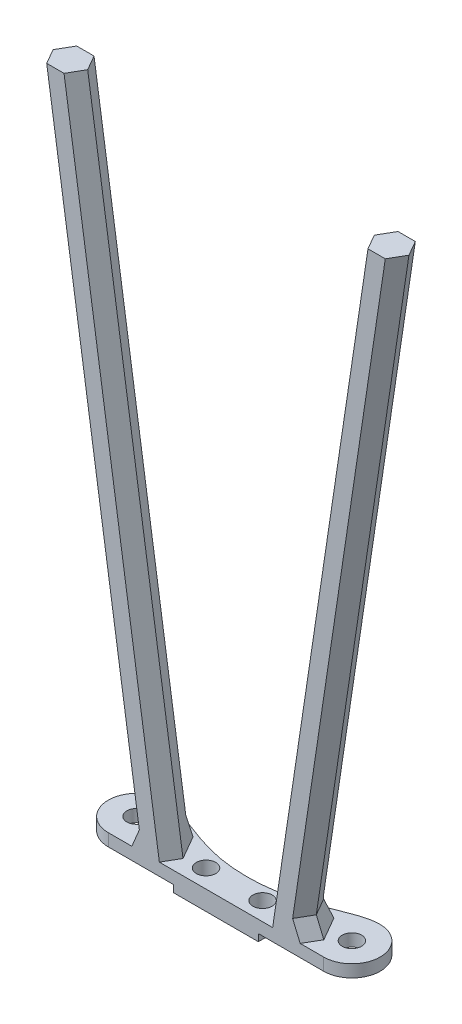
ISO-10303-21;
HEADER;
FILE_DESCRIPTION(('STEP AP214'),'2;1');
FILE_NAME('part.step','',(''),(''),'','','');
FILE_SCHEMA(('AUTOMOTIVE_DESIGN { 1 0 10303 214 1 1 1 1 }'));
ENDSEC;
DATA;
#1=APPLICATION_CONTEXT('core data for automotive mechanical design processes');
#2=APPLICATION_PROTOCOL_DEFINITION('international standard','automotive_design',2000,#1);
#3=PRODUCT_CONTEXT('',#1,'mechanical');
#4=PRODUCT('Part','Part','',(#3));
#5=PRODUCT_RELATED_PRODUCT_CATEGORY('part','',(#4));
#6=PRODUCT_DEFINITION_FORMATION('','',#4);
#7=PRODUCT_DEFINITION_CONTEXT('part definition',#1,'design');
#8=PRODUCT_DEFINITION('design','',#6,#7);
#9=PRODUCT_DEFINITION_SHAPE('','',#8);
#10=(LENGTH_UNIT() NAMED_UNIT(*) SI_UNIT(.MILLI.,.METRE.));
#11=(NAMED_UNIT(*) PLANE_ANGLE_UNIT() SI_UNIT($,.RADIAN.));
#12=(NAMED_UNIT(*) SI_UNIT($,.STERADIAN.) SOLID_ANGLE_UNIT());
#13=UNCERTAINTY_MEASURE_WITH_UNIT(LENGTH_MEASURE(1.E-05),#10,'distance_accuracy_value','');
#14=(GEOMETRIC_REPRESENTATION_CONTEXT(3) GLOBAL_UNCERTAINTY_ASSIGNED_CONTEXT((#13)) GLOBAL_UNIT_ASSIGNED_CONTEXT((#10,
#11,#12)) REPRESENTATION_CONTEXT('',''));
#15=CARTESIAN_POINT('',(0.,0.,0.));
#16=DIRECTION('',(0.,0.,1.));
#17=DIRECTION('',(1.,0.,0.));
#18=AXIS2_PLACEMENT_3D('',#15,#16,#17);
#19=CARTESIAN_POINT('',(0.,0.,0.));
#20=DIRECTION('',(0.,1.,0.));
#21=DIRECTION('',(0.,0.,1.));
#22=AXIS2_PLACEMENT_3D('',#19,#20,#21);
#23=PLANE('',#22);
#24=CARTESIAN_POINT('',(30.5,0.,0.));
#25=DIRECTION('',(0.,1.,0.));
#26=DIRECTION('',(0.,0.,1.));
#27=AXIS2_PLACEMENT_3D('',#24,#25,#26);
#28=CIRCLE('',#27,1.375);
#29=CARTESIAN_POINT('',(30.5,0.,1.375));
#30=VERTEX_POINT('',#29);
#31=EDGE_CURVE('E550',#30,#30,#28,.T.);
#32=ORIENTED_EDGE('',*,*,#31,.T.);
#33=EDGE_LOOP('',(#32));
#34=FACE_BOUND('',#33,.T.);
#35=DIRECTION('',(0.,0.,1.));
#36=VECTOR('',#35,1.);
#37=CARTESIAN_POINT('',(21.25,0.,4.));
#38=LINE('',#37,#36);
#39=CARTESIAN_POINT('',(21.2500000022777,0.,-1.18515930909375));
#40=VERTEX_POINT('',#39);
#41=CARTESIAN_POINT('',(21.2499999999999,0.,4.));
#42=VERTEX_POINT('',#41);
#43=EDGE_CURVE('E257',#40,#42,#38,.T.);
#44=ORIENTED_EDGE('',*,*,#43,.F.);
#45=CARTESIAN_POINT('',(0.,0.,-4.));
#46=CARTESIAN_POINT('',(1.39255410455017,0.,-4.));
#47=CARTESIAN_POINT('',(4.71281611874439,0.,-2.73030225078324));
#48=CARTESIAN_POINT('',(11.2000863087399,0.,-0.21231389307512));
#49=CARTESIAN_POINT('',(19.2746966248633,0.,-0.21231389307512));
#50=CARTESIAN_POINT('',(25.8425779606495,0.,-2.73030225078324));
#51=CARTESIAN_POINT('',(29.0287654370058,0.,-4.));
#52=CARTESIAN_POINT('',(30.5,0.,-4.));
#53=B_SPLINE_CURVE_WITH_KNOTS('',3,(#45,#46,#47,#48,#49,#50,#51,#52),.UNSPECIFIED.,.F.,.F.,(4,1,
1,1,1,4),(0.,0.131328662270549,0.332777634257892,0.667222365742108,0.868671337729451,1.),.UNSPECIFIED.);
#54=CARTESIAN_POINT('',(30.5,0.,-4.));
#55=VERTEX_POINT('',#54);
#56=EDGE_CURVE('E530',#40,#55,#53,.T.);
#57=ORIENTED_EDGE('',*,*,#56,.T.);
#58=CARTESIAN_POINT('',(30.5,0.,0.));
#59=DIRECTION('',(0.,1.,0.));
#60=DIRECTION('',(0.,0.,1.));
#61=AXIS2_PLACEMENT_3D('',#58,#59,#60);
#62=CIRCLE('',#61,4.);
#63=CARTESIAN_POINT('',(30.5,0.,4.));
#64=VERTEX_POINT('',#63);
#65=EDGE_CURVE('E496',#64,#55,#62,.T.);
#66=ORIENTED_EDGE('',*,*,#65,.F.);
#67=DIRECTION('',(1.,0.,0.));
#68=VECTOR('',#67,1.);
#69=CARTESIAN_POINT('',(0.,0.,4.));
#70=LINE('',#69,#68);
#71=EDGE_CURVE('E87',#42,#64,#70,.T.);
#72=ORIENTED_EDGE('',*,*,#71,.F.);
#73=EDGE_LOOP('',(#44,#57,#66,#72));
#74=FACE_BOUND('',#73,.T.);
#75=ADVANCED_FACE('F67',(#34,#74),#23,.F.);
#76=CARTESIAN_POINT('',(0.,0.,0.));
#77=DIRECTION('',(0.,1.,0.));
#78=DIRECTION('',(0.,0.,1.));
#79=AXIS2_PLACEMENT_3D('',#76,#77,#78);
#80=CIRCLE('',#79,1.375);
#81=CARTESIAN_POINT('',(0.,0.,1.375));
#82=VERTEX_POINT('',#81);
#83=EDGE_CURVE('E567',#82,#82,#80,.T.);
#84=ORIENTED_EDGE('',*,*,#83,.T.);
#85=EDGE_LOOP('',(#84));
#86=FACE_BOUND('',#85,.T.);
#87=DIRECTION('',(0.,0.,-1.));
#88=VECTOR('',#87,1.);
#89=CARTESIAN_POINT('',(9.25,0.,4.));
#90=LINE('',#89,#88);
#91=CARTESIAN_POINT('',(9.25000000000021,0.,4.));
#92=VERTEX_POINT('',#91);
#93=CARTESIAN_POINT('',(9.25000000000044,0.,-1.18670499105833));
#94=VERTEX_POINT('',#93);
#95=EDGE_CURVE('E95',#92,#94,#90,.T.);
#96=ORIENTED_EDGE('',*,*,#95,.F.);
#97=CARTESIAN_POINT('',(0.,0.,4.));
#98=VERTEX_POINT('',#97);
#99=EDGE_CURVE('E261',#98,#92,#70,.T.);
#100=ORIENTED_EDGE('',*,*,#99,.F.);
#101=CARTESIAN_POINT('',(0.,0.,0.));
#102=DIRECTION('',(0.,1.,0.));
#103=DIRECTION('',(0.,0.,1.));
#104=AXIS2_PLACEMENT_3D('',#101,#102,#103);
#105=CIRCLE('',#104,4.);
#106=CARTESIAN_POINT('',(0.,0.,-4.));
#107=VERTEX_POINT('',#106);
#108=EDGE_CURVE('E507',#107,#98,#105,.T.);
#109=ORIENTED_EDGE('',*,*,#108,.F.);
#110=EDGE_CURVE('E533',#107,#94,#53,.T.);
#111=ORIENTED_EDGE('',*,*,#110,.T.);
#112=EDGE_LOOP('',(#96,#100,#109,#111));
#113=FACE_BOUND('',#112,.T.);
#114=ADVANCED_FACE('F549',(#86,#113),#23,.F.);
#115=CARTESIAN_POINT('',(0.,1.75,0.));
#116=DIRECTION('',(0.,1.,0.));
#117=DIRECTION('',(0.,0.,1.));
#118=AXIS2_PLACEMENT_3D('',#115,#116,#117);
#119=PLANE('',#118);
#120=CARTESIAN_POINT('',(11.2499999958524,1.75,1.40677631135101));
#121=DIRECTION('',(0.,1.,0.));
#122=DIRECTION('',(0.,0.,1.));
#123=AXIS2_PLACEMENT_3D('',#120,#121,#122);
#124=CIRCLE('',#123,1.375);
#125=CARTESIAN_POINT('',(11.2499999958524,1.75,2.78177631135101));
#126=VERTEX_POINT('',#125);
#127=EDGE_CURVE('E552',#126,#126,#124,.T.);
#128=ORIENTED_EDGE('',*,*,#127,.F.);
#129=EDGE_LOOP('',(#128));
#130=FACE_BOUND('',#129,.T.);
#131=CARTESIAN_POINT('',(19.2500000041475,1.75,1.4072915388733));
#132=DIRECTION('',(0.,1.,0.));
#133=DIRECTION('',(0.,0.,1.));
#134=AXIS2_PLACEMENT_3D('',#131,#132,#133);
#135=CIRCLE('',#134,1.375);
#136=CARTESIAN_POINT('',(19.2500000041475,1.75,2.7822915388733));
#137=VERTEX_POINT('',#136);
#138=EDGE_CURVE('E604',#137,#137,#135,.T.);
#139=ORIENTED_EDGE('',*,*,#138,.F.);
#140=EDGE_LOOP('',(#139));
#141=FACE_BOUND('',#140,.T.);
#142=CARTESIAN_POINT('',(0.,1.75,0.));
#143=DIRECTION('',(0.,1.,0.));
#144=DIRECTION('',(0.,0.,1.));
#145=AXIS2_PLACEMENT_3D('',#142,#143,#144);
#146=CIRCLE('',#145,1.375);
#147=CARTESIAN_POINT('',(0.,1.75,1.375));
#148=VERTEX_POINT('',#147);
#149=EDGE_CURVE('E509',#148,#148,#146,.T.);
#150=ORIENTED_EDGE('',*,*,#149,.F.);
#151=EDGE_LOOP('',(#150));
#152=FACE_BOUND('',#151,.T.);
#153=CARTESIAN_POINT('',(30.5,1.75,0.));
#154=DIRECTION('',(0.,1.,0.));
#155=DIRECTION('',(0.,0.,1.));
#156=AXIS2_PLACEMENT_3D('',#153,#154,#155);
#157=CIRCLE('',#156,1.375);
#158=CARTESIAN_POINT('',(30.5,1.75,1.375));
#159=VERTEX_POINT('',#158);
#160=EDGE_CURVE('E560',#159,#159,#157,.T.);
#161=ORIENTED_EDGE('',*,*,#160,.F.);
#162=EDGE_LOOP('',(#161));
#163=FACE_BOUND('',#162,.T.);
#164=DIRECTION('',(0.5,0.,-0.866025403784438));
#165=VECTOR('',#164,1.);
#166=CARTESIAN_POINT('',(22.0462613559441,1.75,1.87500000000001));
#167=LINE('',#166,#165);
#168=CARTESIAN_POINT('',(22.0462613559441,1.75,1.875));
#169=VERTEX_POINT('',#168);
#170=CARTESIAN_POINT('',(23.9948185144591,1.75,-1.5));
#171=VERTEX_POINT('',#170);
#172=EDGE_CURVE('E410',#169,#171,#167,.T.);
#173=ORIENTED_EDGE('',*,*,#172,.T.);
#174=DIRECTION('',(1.,0.,0.));
#175=VECTOR('',#174,1.);
#176=CARTESIAN_POINT('',(0.,1.75,-1.5));
#177=LINE('',#176,#175);
#178=CARTESIAN_POINT('',(26.448557158515,1.75,-1.5));
#179=VERTEX_POINT('',#178);
#180=EDGE_CURVE('E1011',#171,#179,#177,.T.);
#181=ORIENTED_EDGE('',*,*,#180,.T.);
#182=DIRECTION('',(0.5,0.,0.866025403784439));
#183=VECTOR('',#182,1.);
#184=CARTESIAN_POINT('',(20.4859369217246,1.75,-11.8275611963594));
#185=LINE('',#184,#183);
#186=CARTESIAN_POINT('',(28.39711431703,1.75,1.875));
#187=VERTEX_POINT('',#186);
#188=EDGE_CURVE('E1013',#179,#187,#185,.T.);
#189=ORIENTED_EDGE('',*,*,#188,.T.);
#190=DIRECTION('',(-0.5,0.,0.866025403784439));
#191=VECTOR('',#190,1.);
#192=CARTESIAN_POINT('',(22.1097345538204,1.75,12.7650611963594));
#193=LINE('',#192,#191);
#194=CARTESIAN_POINT('',(27.170244995002,1.75,4.));
#195=VERTEX_POINT('',#194);
#196=EDGE_CURVE('E402',#187,#195,#193,.T.);
#197=ORIENTED_EDGE('',*,*,#196,.T.);
#198=DIRECTION('',(1.,0.,0.));
#199=VECTOR('',#198,1.);
#200=CARTESIAN_POINT('',(0.,1.75,4.));
#201=LINE('',#200,#199);
#202=CARTESIAN_POINT('',(30.5,1.75,4.));
#203=VERTEX_POINT('',#202);
#204=EDGE_CURVE('E423',#195,#203,#201,.T.);
#205=ORIENTED_EDGE('',*,*,#204,.T.);
#206=CARTESIAN_POINT('',(30.5,1.75,0.));
#207=DIRECTION('',(0.,1.,0.));
#208=DIRECTION('',(0.,0.,1.));
#209=AXIS2_PLACEMENT_3D('',#206,#207,#208);
#210=CIRCLE('',#209,4.);
#211=CARTESIAN_POINT('',(30.5,1.75,-4.));
#212=VERTEX_POINT('',#211);
#213=EDGE_CURVE('E504',#203,#212,#210,.T.);
#214=ORIENTED_EDGE('',*,*,#213,.T.);
#215=CARTESIAN_POINT('',(0.,1.75,-4.));
#216=CARTESIAN_POINT('',(1.39255410455017,1.75,-4.));
#217=CARTESIAN_POINT('',(4.71281611874439,1.75,-2.73030225078324));
#218=CARTESIAN_POINT('',(11.2000863087399,1.75,-0.21231389307512));
#219=CARTESIAN_POINT('',(19.2746966248633,1.75,-0.21231389307512));
#220=CARTESIAN_POINT('',(25.8425779606495,1.75,-2.73030225078324));
#221=CARTESIAN_POINT('',(29.0287654370058,1.75,-4.));
#222=CARTESIAN_POINT('',(30.5,1.75,-4.));
#223=B_SPLINE_CURVE_WITH_KNOTS('',3,(#215,#216,#217,#218,#219,#220,#221,#222),.UNSPECIFIED.,.F.,
.F.,(4,1,1,1,1,4),(0.,0.131328662270549,0.332777634257892,0.667222365742108,0.868671337729451,
1.),.UNSPECIFIED.);
#224=CARTESIAN_POINT('',(0.,1.75,-4.));
#225=VERTEX_POINT('',#224);
#226=EDGE_CURVE('E534',#225,#212,#223,.T.);
#227=ORIENTED_EDGE('',*,*,#226,.F.);
#228=CARTESIAN_POINT('',(0.,1.75,0.));
#229=DIRECTION('',(0.,1.,0.));
#230=DIRECTION('',(0.,0.,1.));
#231=AXIS2_PLACEMENT_3D('',#228,#229,#230);
#232=CIRCLE('',#231,4.);
#233=CARTESIAN_POINT('',(0.,1.75,4.));
#234=VERTEX_POINT('',#233);
#235=EDGE_CURVE('E499',#225,#234,#232,.T.);
#236=ORIENTED_EDGE('',*,*,#235,.T.);
#237=CARTESIAN_POINT('',(3.32975500499798,1.75,4.));
#238=VERTEX_POINT('',#237);
#239=EDGE_CURVE('E512',#234,#238,#201,.T.);
#240=ORIENTED_EDGE('',*,*,#239,.T.);
#241=DIRECTION('',(-0.5,0.,-0.866025403784439));
#242=VECTOR('',#241,1.);
#243=CARTESIAN_POINT('',(0.765265446179611,1.75,-0.441826211353318));
#244=LINE('',#243,#242);
#245=CARTESIAN_POINT('',(2.10288568297003,1.75,1.875));
#246=VERTEX_POINT('',#245);
#247=EDGE_CURVE('E474',#238,#246,#244,.T.);
#248=ORIENTED_EDGE('',*,*,#247,.T.);
#249=DIRECTION('',(0.5,0.,-0.866025403784439));
#250=VECTOR('',#249,1.);
#251=CARTESIAN_POINT('',(2.38906307827543,1.75,1.37932621135332));
#252=LINE('',#251,#250);
#253=CARTESIAN_POINT('',(4.05144284148502,1.75,-1.5));
#254=VERTEX_POINT('',#253);
#255=EDGE_CURVE('E472',#246,#254,#252,.T.);
#256=ORIENTED_EDGE('',*,*,#255,.T.);
#257=DIRECTION('',(1.,0.,0.));
#258=VECTOR('',#257,1.);
#259=CARTESIAN_POINT('',(0.,1.75,-1.5));
#260=LINE('',#259,#258);
#261=CARTESIAN_POINT('',(6.50518148554092,1.75,-1.5));
#262=VERTEX_POINT('',#261);
#263=EDGE_CURVE('E469',#254,#262,#260,.T.);
#264=ORIENTED_EDGE('',*,*,#263,.T.);
#265=DIRECTION('',(-0.5,0.,-0.866025403784438));
#266=VECTOR('',#265,1.);
#267=CARTESIAN_POINT('',(8.45373864405591,1.75,1.875));
#268=LINE('',#267,#266);
#269=CARTESIAN_POINT('',(8.45373864405591,1.75,1.875));
#270=VERTEX_POINT('',#269);
#271=EDGE_CURVE('E986',#270,#262,#268,.T.);
#272=ORIENTED_EDGE('',*,*,#271,.F.);
#273=DIRECTION('',(0.500000000000001,0.,-0.866025403784438));
#274=VECTOR('',#273,1.);
#275=CARTESIAN_POINT('',(7.22686932202795,1.75,4.));
#276=LINE('',#275,#274);
#277=CARTESIAN_POINT('',(7.22686932202795,1.75,4.));
#278=VERTEX_POINT('',#277);
#279=EDGE_CURVE('E409',#278,#270,#276,.T.);
#280=ORIENTED_EDGE('',*,*,#279,.F.);
#281=CARTESIAN_POINT('',(23.273130677972,1.75,4.));
#282=VERTEX_POINT('',#281);
#283=EDGE_CURVE('E515',#278,#282,#201,.T.);
#284=ORIENTED_EDGE('',*,*,#283,.T.);
#285=DIRECTION('',(-0.5,0.,-0.866025403784439));
#286=VECTOR('',#285,1.);
#287=CARTESIAN_POINT('',(23.273130677972,1.75,4.));
#288=LINE('',#287,#286);
#289=EDGE_CURVE('E413',#282,#169,#288,.T.);
#290=ORIENTED_EDGE('',*,*,#289,.T.);
#291=EDGE_LOOP('',(#173,#181,#189,#197,#205,#214,#227,#236,#240,#248,#256,#264,#272,#280,#284,#290));
#292=FACE_BOUND('',#291,.T.);
#293=ADVANCED_FACE('F543',(#130,#141,#152,#163,#292),#119,.T.);
#294=CARTESIAN_POINT('',(0.,1.75,0.));
#295=DIRECTION('',(0.,-1.,0.));
#296=DIRECTION('',(0.,0.,-1.));
#297=AXIS2_PLACEMENT_3D('',#294,#295,#296);
#298=CYLINDRICAL_SURFACE('',#297,4.);
#299=ORIENTED_EDGE('',*,*,#108,.T.);
#300=DIRECTION('',(0.,-1.,0.));
#301=VECTOR('',#300,1.);
#302=CARTESIAN_POINT('',(0.,1.75,4.));
#303=LINE('',#302,#301);
#304=EDGE_CURVE('E477',#234,#98,#303,.T.);
#305=ORIENTED_EDGE('',*,*,#304,.F.);
#306=ORIENTED_EDGE('',*,*,#235,.F.);
#307=DIRECTION('',(0.,-1.,0.));
#308=VECTOR('',#307,1.);
#309=CARTESIAN_POINT('',(0.,1.75,-4.));
#310=LINE('',#309,#308);
#311=EDGE_CURVE('E493',#225,#107,#310,.T.);
#312=ORIENTED_EDGE('',*,*,#311,.T.);
#313=EDGE_LOOP('',(#299,#305,#306,#312));
#314=FACE_BOUND('',#313,.T.);
#315=ADVANCED_FACE('F436',(#314),#298,.T.);
#316=CARTESIAN_POINT('',(0.,1.75,4.));
#317=DIRECTION('',(0.,0.,-1.));
#318=DIRECTION('',(-1.,0.,0.));
#319=AXIS2_PLACEMENT_3D('',#316,#317,#318);
#320=PLANE('',#319);
#321=ORIENTED_EDGE('',*,*,#99,.T.);
#322=DIRECTION('',(0.,1.,0.));
#323=VECTOR('',#322,1.);
#324=CARTESIAN_POINT('',(9.25,-1.,4.));
#325=LINE('',#324,#323);
#326=CARTESIAN_POINT('',(9.25,-1.,4.));
#327=VERTEX_POINT('',#326);
#328=EDGE_CURVE('E242',#327,#92,#325,.T.);
#329=ORIENTED_EDGE('',*,*,#328,.F.);
#330=DIRECTION('',(-1.,0.,0.));
#331=VECTOR('',#330,1.);
#332=CARTESIAN_POINT('',(9.25,-1.,4.));
#333=LINE('',#332,#331);
#334=CARTESIAN_POINT('',(21.25,-1.,4.));
#335=VERTEX_POINT('',#334);
#336=EDGE_CURVE('E248',#335,#327,#333,.T.);
#337=ORIENTED_EDGE('',*,*,#336,.F.);
#338=DIRECTION('',(0.,1.,0.));
#339=VECTOR('',#338,1.);
#340=CARTESIAN_POINT('',(21.25,-1.,4.));
#341=LINE('',#340,#339);
#342=EDGE_CURVE('E270',#335,#42,#341,.T.);
#343=ORIENTED_EDGE('',*,*,#342,.T.);
#344=ORIENTED_EDGE('',*,*,#71,.T.);
#345=DIRECTION('',(0.,-1.,0.));
#346=VECTOR('',#345,1.);
#347=CARTESIAN_POINT('',(30.5,1.75,4.));
#348=LINE('',#347,#346);
#349=EDGE_CURVE('E482',#203,#64,#348,.T.);
#350=ORIENTED_EDGE('',*,*,#349,.F.);
#351=ORIENTED_EDGE('',*,*,#204,.F.);
#352=DIRECTION('',(-0.38744925241057,0.92189103304376,0.));
#353=VECTOR('',#352,1.);
#354=CARTESIAN_POINT('',(23.0915314139385,11.4548308993813,4.));
#355=LINE('',#354,#353);
#356=CARTESIAN_POINT('',(26.1065207776194,4.28100970394284,4.));
#357=VERTEX_POINT('',#356);
#358=EDGE_CURVE('E12',#195,#357,#355,.T.);
#359=ORIENTED_EDGE('',*,*,#358,.T.);
#360=DIRECTION('',(0.148340452930245,0.988936352868298,0.));
#361=VECTOR('',#360,1.);
#362=CARTESIAN_POINT('',(25.726869322028,1.75,4.));
#363=LINE('',#362,#361);
#364=CARTESIAN_POINT('',(39.226869322028,91.75,4.));
#365=VERTEX_POINT('',#364);
#366=EDGE_CURVE('E998',#357,#365,#363,.T.);
#367=ORIENTED_EDGE('',*,*,#366,.T.);
#368=CARTESIAN_POINT('',(39.226869322028,91.75,4.));
#369=DIRECTION('',(-1.,0.,0.));
#370=VECTOR('',#369,1.);
#371=LINE('',#368,#370);
#372=CARTESIAN_POINT('',(36.773130677972,91.75,4.));
#373=VERTEX_POINT('',#372);
#374=EDGE_CURVE('E323',#365,#373,#371,.T.);
#375=ORIENTED_EDGE('',*,*,#374,.T.);
#376=DIRECTION('',(0.148340452930245,0.988936352868298,0.));
#377=VECTOR('',#376,1.);
#378=CARTESIAN_POINT('',(23.273130677972,1.75,4.));
#379=LINE('',#378,#377);
#380=EDGE_CURVE('E412',#282,#373,#379,.T.);
#381=ORIENTED_EDGE('',*,*,#380,.F.);
#382=ORIENTED_EDGE('',*,*,#283,.F.);
#383=DIRECTION('',(-0.148340452930245,0.988936352868298,0.));
#384=VECTOR('',#383,1.);
#385=CARTESIAN_POINT('',(7.22686932202795,1.75,4.));
#386=LINE('',#385,#384);
#387=CARTESIAN_POINT('',(-6.27313067797204,91.75,4.));
#388=VERTEX_POINT('',#387);
#389=EDGE_CURVE('E384',#278,#388,#386,.T.);
#390=ORIENTED_EDGE('',*,*,#389,.T.);
#391=DIRECTION('',(1.,0.,0.));
#392=VECTOR('',#391,1.);
#393=CARTESIAN_POINT('',(-8.72686932202795,91.75,4.));
#394=LINE('',#393,#392);
#395=CARTESIAN_POINT('',(-8.72686932202795,91.75,4.));
#396=VERTEX_POINT('',#395);
#397=EDGE_CURVE('E541',#396,#388,#394,.T.);
#398=ORIENTED_EDGE('',*,*,#397,.F.);
#399=DIRECTION('',(-0.148340452930245,0.988936352868298,0.));
#400=VECTOR('',#399,1.);
#401=CARTESIAN_POINT('',(4.77313067797204,1.75,4.));
#402=LINE('',#401,#400);
#403=CARTESIAN_POINT('',(4.39347922238062,4.28100970394282,4.));
#404=VERTEX_POINT('',#403);
#405=EDGE_CURVE('E387',#404,#396,#402,.T.);
#406=ORIENTED_EDGE('',*,*,#405,.F.);
#407=DIRECTION('',(-0.38744925241057,-0.92189103304376,0.));
#408=VECTOR('',#407,1.);
#409=CARTESIAN_POINT('',(2.8299024286595,0.560658156898535,4.));
#410=LINE('',#409,#408);
#411=EDGE_CURVE('E400',#404,#238,#410,.T.);
#412=ORIENTED_EDGE('',*,*,#411,.T.);
#413=ORIENTED_EDGE('',*,*,#239,.F.);
#414=ORIENTED_EDGE('',*,*,#304,.T.);
#415=EDGE_LOOP('',(#321,#329,#337,#343,#344,#350,#351,#359,#367,#375,#381,#382,#390,#398,#406,
#412,#413,#414));
#416=FACE_BOUND('',#415,.T.);
#417=ADVANCED_FACE('F259',(#416),#320,.F.);
#418=CARTESIAN_POINT('',(30.5,1.75,0.));
#419=DIRECTION('',(0.,-1.,0.));
#420=DIRECTION('',(0.,0.,-1.));
#421=AXIS2_PLACEMENT_3D('',#418,#419,#420);
#422=CYLINDRICAL_SURFACE('',#421,4.);
#423=ORIENTED_EDGE('',*,*,#65,.T.);
#424=DIRECTION('',(0.,-1.,0.));
#425=VECTOR('',#424,1.);
#426=CARTESIAN_POINT('',(30.5,1.75,-4.));
#427=LINE('',#426,#425);
#428=EDGE_CURVE('E487',#212,#55,#427,.T.);
#429=ORIENTED_EDGE('',*,*,#428,.F.);
#430=ORIENTED_EDGE('',*,*,#213,.F.);
#431=ORIENTED_EDGE('',*,*,#349,.T.);
#432=EDGE_LOOP('',(#423,#429,#430,#431));
#433=FACE_BOUND('',#432,.T.);
#434=ADVANCED_FACE('F435',(#433),#422,.T.);
#435=CARTESIAN_POINT('',(0.,1.75,0.));
#436=DIRECTION('',(0.,-1.,0.));
#437=DIRECTION('',(0.,0.,-1.));
#438=AXIS2_PLACEMENT_3D('',#435,#436,#437);
#439=CYLINDRICAL_SURFACE('',#438,1.375);
#440=ORIENTED_EDGE('',*,*,#149,.T.);
#441=EDGE_LOOP('',(#440));
#442=FACE_BOUND('',#441,.T.);
#443=ORIENTED_EDGE('',*,*,#83,.F.);
#444=EDGE_LOOP('',(#443));
#445=FACE_BOUND('',#444,.T.);
#446=ADVANCED_FACE('F575',(#442,#445),#439,.F.);
#447=CARTESIAN_POINT('',(30.5,1.75,0.));
#448=DIRECTION('',(0.,-1.,0.));
#449=DIRECTION('',(0.,0.,-1.));
#450=AXIS2_PLACEMENT_3D('',#447,#448,#449);
#451=CYLINDRICAL_SURFACE('',#450,1.375);
#452=ORIENTED_EDGE('',*,*,#160,.T.);
#453=EDGE_LOOP('',(#452));
#454=FACE_BOUND('',#453,.T.);
#455=ORIENTED_EDGE('',*,*,#31,.F.);
#456=EDGE_LOOP('',(#455));
#457=FACE_BOUND('',#456,.T.);
#458=ADVANCED_FACE('F577',(#454,#457),#451,.F.);
#459=CARTESIAN_POINT('',(0.,-8.25,-4.));
#460=CARTESIAN_POINT('',(1.39255410455017,-8.25,-4.));
#461=CARTESIAN_POINT('',(4.71281611874439,-8.25,-2.73030225078324));
#462=CARTESIAN_POINT('',(11.2000863087399,-8.25,-0.21231389307512));
#463=CARTESIAN_POINT('',(19.2746966248633,-8.25,-0.21231389307512));
#464=CARTESIAN_POINT('',(25.8425779606495,-8.25,-2.73030225078324));
#465=CARTESIAN_POINT('',(29.0287654370058,-8.25,-4.));
#466=CARTESIAN_POINT('',(30.5,-8.25,-4.));
#467=B_SPLINE_CURVE_WITH_KNOTS('',3,(#459,#460,#461,#462,#463,#464,#465,#466),.UNSPECIFIED.,.F.,
.F.,(4,1,1,1,1,4),(0.,0.131328662270549,0.332777634257892,0.667222365742108,0.868671337729451,
1.),.UNSPECIFIED.);
#468=DIRECTION('',(0.,1.,0.));
#469=VECTOR('',#468,1.);
#470=SURFACE_OF_LINEAR_EXTRUSION('',#467,#469);
#471=ORIENTED_EDGE('',*,*,#311,.F.);
#472=ORIENTED_EDGE('',*,*,#226,.T.);
#473=ORIENTED_EDGE('',*,*,#428,.T.);
#474=ORIENTED_EDGE('',*,*,#56,.F.);
#475=DIRECTION('',(0.,1.,0.));
#476=VECTOR('',#475,1.);
#477=CARTESIAN_POINT('',(21.2499999999998,-0.5,-1.18515930849314));
#478=LINE('',#477,#476);
#479=CARTESIAN_POINT('',(21.2499999999995,-1.,-1.18515930849306));
#480=VERTEX_POINT('',#479);
#481=EDGE_CURVE('E266',#480,#40,#478,.T.);
#482=ORIENTED_EDGE('',*,*,#481,.F.);
#483=CARTESIAN_POINT('',(21.2499999999995,-1.,-1.18515930849306));
#484=CARTESIAN_POINT('',(21.0011776639861,-1.,-1.11955383888622));
#485=CARTESIAN_POINT('',(17.3367659021271,-1.,-0.21231389307512));
#486=CARTESIAN_POINT('',(13.1359122372325,-1.,-0.21231389307512));
#487=CARTESIAN_POINT('',(9.49875644908344,-1.,-1.12052572867879));
#488=CARTESIAN_POINT('',(9.25000000000059,-1.,-1.18670499105829));
#489=B_SPLINE_CURVE_WITH_KNOTS('',3,(#483,#484,#485,#486,#487,#488),.UNSPECIFIED.,.F.,.F.,(4,1,
1,4),(0.308100916714488,0.33258543246014,0.667030163944357,0.691706881487761),.UNSPECIFIED.);
#490=CARTESIAN_POINT('',(9.25000000000044,-1.,-1.18670499105833));
#491=VERTEX_POINT('',#490);
#492=EDGE_CURVE('E247',#491,#480,#489,.F.);
#493=ORIENTED_EDGE('',*,*,#492,.F.);
#494=DIRECTION('',(0.,1.,0.));
#495=VECTOR('',#494,1.);
#496=CARTESIAN_POINT('',(9.25000000000043,-0.5,-1.18670499105833));
#497=LINE('',#496,#495);
#498=EDGE_CURVE('E244',#491,#94,#497,.T.);
#499=ORIENTED_EDGE('',*,*,#498,.T.);
#500=ORIENTED_EDGE('',*,*,#110,.F.);
#501=EDGE_LOOP('',(#471,#472,#473,#474,#482,#493,#499,#500));
#502=FACE_BOUND('',#501,.T.);
#503=ADVANCED_FACE('F536',(#502),#470,.F.);
#504=CARTESIAN_POINT('',(0.,91.75,0.));
#505=DIRECTION('',(0.,1.,0.));
#506=DIRECTION('',(0.,0.,1.));
#507=AXIS2_PLACEMENT_3D('',#504,#505,#506);
#508=PLANE('',#507);
#509=DIRECTION('',(0.5,0.,-0.866025403784439));
#510=VECTOR('',#509,1.);
#511=CARTESIAN_POINT('',(-6.27313067797204,91.75,4.));
#512=LINE('',#511,#510);
#513=CARTESIAN_POINT('',(-5.04626135594409,91.75,1.875));
#514=VERTEX_POINT('',#513);
#515=EDGE_CURVE('E468',#388,#514,#512,.T.);
#516=ORIENTED_EDGE('',*,*,#515,.T.);
#517=DIRECTION('',(-0.5,0.,-0.866025403784439));
#518=VECTOR('',#517,1.);
#519=CARTESIAN_POINT('',(-5.04626135594409,91.75,1.875));
#520=LINE('',#519,#518);
#521=CARTESIAN_POINT('',(-6.27313067797204,91.75,-0.250000000000003));
#522=VERTEX_POINT('',#521);
#523=EDGE_CURVE('E911',#514,#522,#520,.T.);
#524=ORIENTED_EDGE('',*,*,#523,.T.);
#525=DIRECTION('',(-1.,0.,0.));
#526=VECTOR('',#525,1.);
#527=CARTESIAN_POINT('',(-6.27313067797204,91.75,-0.250000000000002));
#528=LINE('',#527,#526);
#529=CARTESIAN_POINT('',(-8.72686932202796,91.75,-0.250000000000002));
#530=VERTEX_POINT('',#529);
#531=EDGE_CURVE('E918',#522,#530,#528,.T.);
#532=ORIENTED_EDGE('',*,*,#531,.T.);
#533=DIRECTION('',(-0.5,0.,0.866025403784439));
#534=VECTOR('',#533,1.);
#535=CARTESIAN_POINT('',(-8.72686932202796,91.75,-0.250000000000002));
#536=LINE('',#535,#534);
#537=CARTESIAN_POINT('',(-9.95373864405591,91.75,1.875));
#538=VERTEX_POINT('',#537);
#539=EDGE_CURVE('E922',#530,#538,#536,.T.);
#540=ORIENTED_EDGE('',*,*,#539,.T.);
#541=DIRECTION('',(0.5,0.,0.866025403784438));
#542=VECTOR('',#541,1.);
#543=CARTESIAN_POINT('',(-9.95373864405591,91.75,1.875));
#544=LINE('',#543,#542);
#545=EDGE_CURVE('E964',#538,#396,#544,.T.);
#546=ORIENTED_EDGE('',*,*,#545,.T.);
#547=ORIENTED_EDGE('',*,*,#397,.T.);
#548=EDGE_LOOP('',(#516,#524,#532,#540,#546,#547));
#549=FACE_BOUND('',#548,.T.);
#550=ADVANCED_FACE('F664',(#549),#508,.T.);
#551=CARTESIAN_POINT('',(2.0107409474224,0.30161114211336,-1.16090182726493));
#552=DIRECTION('',(0.858809513200175,0.128821426980026,-0.495833903628733));
#553=DIRECTION('',(-0.5,0.,-0.866025403784439));
#554=AXIS2_PLACEMENT_3D('',#551,#552,#553);
#555=PLANE('',#554);
#556=DIRECTION('',(-0.148340452930245,0.988936352868298,0.));
#557=VECTOR('',#556,1.);
#558=CARTESIAN_POINT('',(3.54626135594409,1.75,1.875));
#559=LINE('',#558,#557);
#560=CARTESIAN_POINT('',(3.16660990035267,4.28100970394282,1.875));
#561=VERTEX_POINT('',#560);
#562=EDGE_CURVE('E455',#561,#538,#559,.T.);
#563=ORIENTED_EDGE('',*,*,#562,.F.);
#564=DIRECTION('',(0.5,0.,0.866025403784439));
#565=VECTOR('',#564,1.);
#566=CARTESIAN_POINT('',(1.56305860921659,4.28100970394282,-0.902432308790359));
#567=LINE('',#566,#565);
#568=EDGE_CURVE('E393',#561,#404,#567,.T.);
#569=ORIENTED_EDGE('',*,*,#568,.T.);
#570=ORIENTED_EDGE('',*,*,#405,.T.);
#571=ORIENTED_EDGE('',*,*,#545,.F.);
#572=EDGE_LOOP('',(#563,#569,#570,#571));
#573=FACE_BOUND('',#572,.T.);
#574=ADVANCED_FACE('F342',(#573),#555,.F.);
#575=CARTESIAN_POINT('',(7.2271201466157,1.08406802199236,4.17257976211434));
#576=DIRECTION('',(-0.858809513200175,-0.128821426980026,-0.495833903628733));
#577=DIRECTION('',(-0.5,0.,0.866025403784439));
#578=AXIS2_PLACEMENT_3D('',#575,#576,#577);
#579=PLANE('',#578);
#580=DIRECTION('',(-0.148340452930245,0.988936352868298,0.));
#581=VECTOR('',#580,1.);
#582=CARTESIAN_POINT('',(8.45373864405591,1.75,1.875));
#583=LINE('',#582,#581);
#584=EDGE_CURVE('E390',#270,#514,#583,.T.);
#585=ORIENTED_EDGE('',*,*,#584,.T.);
#586=ORIENTED_EDGE('',*,*,#515,.F.);
#587=ORIENTED_EDGE('',*,*,#389,.F.);
#588=ORIENTED_EDGE('',*,*,#279,.T.);
#589=EDGE_LOOP('',(#585,#586,#587,#588));
#590=FACE_BOUND('',#589,.T.);
#591=ADVANCED_FACE('F805',(#590),#579,.F.);
#592=CARTESIAN_POINT('',(5.63026937135244,0.844540405702866,-3.25063753716044));
#593=DIRECTION('',(-0.858809513200175,-0.128821426980026,0.495833903628733));
#594=DIRECTION('',(0.5,0.,0.866025403784438));
#595=AXIS2_PLACEMENT_3D('',#592,#593,#594);
#596=PLANE('',#595);
#597=ORIENTED_EDGE('',*,*,#271,.T.);
#598=DIRECTION('',(0.0564215079791159,0.938195726106696,0.341475318218597));
#599=VECTOR('',#598,1.);
#600=CARTESIAN_POINT('',(6.42073757591826,0.345838396714983,-2.01107302769524));
#601=LINE('',#600,#599);
#602=CARTESIAN_POINT('',(6.7117173058802,5.18434677431835,-0.249999999999999));
#603=VERTEX_POINT('',#602);
#604=EDGE_CURVE('E398',#262,#603,#601,.T.);
#605=ORIENTED_EDGE('',*,*,#604,.T.);
#606=DIRECTION('',(-0.148340452930245,0.988936352868298,0.));
#607=VECTOR('',#606,1.);
#608=CARTESIAN_POINT('',(7.22686932202795,1.75,-0.249999999999998));
#609=LINE('',#608,#607);
#610=EDGE_CURVE('E456',#603,#522,#609,.T.);
#611=ORIENTED_EDGE('',*,*,#610,.T.);
#612=ORIENTED_EDGE('',*,*,#523,.F.);
#613=ORIENTED_EDGE('',*,*,#584,.F.);
#614=EDGE_LOOP('',(#597,#605,#611,#612,#613));
#615=FACE_BOUND('',#614,.T.);
#616=ADVANCED_FACE('F797',(#615),#596,.F.);
#617=CARTESIAN_POINT('',(0.,0.,-0.249999999999997));
#618=DIRECTION('',(0.,0.,1.));
#619=DIRECTION('',(1.,0.,0.));
#620=AXIS2_PLACEMENT_3D('',#617,#618,#619);
#621=PLANE('',#620);
#622=ORIENTED_EDGE('',*,*,#610,.F.);
#623=DIRECTION('',(-1.,0.,0.));
#624=VECTOR('',#623,1.);
#625=CARTESIAN_POINT('',(0.,5.18434677431835,-0.249999999999998));
#626=LINE('',#625,#624);
#627=CARTESIAN_POINT('',(4.25797866182429,5.18434677431835,-0.249999999999998));
#628=VERTEX_POINT('',#627);
#629=EDGE_CURVE('E475',#603,#628,#626,.T.);
#630=ORIENTED_EDGE('',*,*,#629,.T.);
#631=DIRECTION('',(-0.148340452930245,0.988936352868298,0.));
#632=VECTOR('',#631,1.);
#633=CARTESIAN_POINT('',(4.77313067797204,1.75,-0.249999999999998));
#634=LINE('',#633,#632);
#635=EDGE_CURVE('E447',#628,#530,#634,.T.);
#636=ORIENTED_EDGE('',*,*,#635,.T.);
#637=ORIENTED_EDGE('',*,*,#531,.F.);
#638=EDGE_LOOP('',(#622,#630,#636,#637));
#639=FACE_BOUND('',#638,.T.);
#640=ADVANCED_FACE('F788',(#639),#621,.F.);
#641=CARTESIAN_POINT('',(3.60759172268566,0.541138758402849,2.08284405221883));
#642=DIRECTION('',(0.858809513200175,0.128821426980026,0.495833903628733));
#643=DIRECTION('',(0.5,0.,-0.866025403784439));
#644=AXIS2_PLACEMENT_3D('',#641,#642,#643);
#645=PLANE('',#644);
#646=DIRECTION('',(0.320560289569971,-0.890103269322987,-0.323971095456594));
#647=VECTOR('',#646,1.);
#648=CARTESIAN_POINT('',(5.2737291931638,2.36390114153354,-1.27655825769975));
#649=LINE('',#648,#647);
#650=CARTESIAN_POINT('',(4.58330495017634,4.28100970394282,-0.578787805125918));
#651=VERTEX_POINT('',#650);
#652=EDGE_CURVE('E395',#628,#651,#649,.T.);
#653=ORIENTED_EDGE('',*,*,#652,.T.);
#654=DIRECTION('',(-0.5,0.,0.866025403784439));
#655=VECTOR('',#654,1.);
#656=CARTESIAN_POINT('',(3.18685624131241,4.28100970394282,1.83993230879036));
#657=LINE('',#656,#655);
#658=EDGE_CURVE('E391',#651,#561,#657,.T.);
#659=ORIENTED_EDGE('',*,*,#658,.T.);
#660=ORIENTED_EDGE('',*,*,#562,.T.);
#661=ORIENTED_EDGE('',*,*,#539,.F.);
#662=ORIENTED_EDGE('',*,*,#635,.F.);
#663=EDGE_LOOP('',(#653,#659,#660,#661,#662));
#664=FACE_BOUND('',#663,.T.);
#665=ADVANCED_FACE('F779',(#664),#645,.F.);
#666=CARTESIAN_POINT('',(1.56305860921659,4.28100970394282,-0.902432308790359));
#667=DIRECTION('',(0.813797681349375,-0.342020143325663,-0.469846310392955));
#668=DIRECTION('',(0.5,0.,0.866025403784439));
#669=AXIS2_PLACEMENT_3D('',#666,#667,#668);
#670=PLANE('',#669);
#671=ORIENTED_EDGE('',*,*,#411,.F.);
#672=ORIENTED_EDGE('',*,*,#568,.F.);
#673=DIRECTION('',(-0.38744925241057,-0.92189103304376,0.));
#674=VECTOR('',#673,1.);
#675=CARTESIAN_POINT('',(2.92588971434434,3.70824364600617,1.875));
#676=LINE('',#675,#674);
#677=EDGE_CURVE('E406',#246,#561,#676,.F.);
#678=ORIENTED_EDGE('',*,*,#677,.F.);
#679=ORIENTED_EDGE('',*,*,#247,.F.);
#680=EDGE_LOOP('',(#671,#672,#678,#679));
#681=FACE_BOUND('',#680,.T.);
#682=ADVANCED_FACE('F770',(#681),#670,.F.);
#683=CARTESIAN_POINT('',(3.18685624131241,4.28100970394282,1.83993230879036));
#684=DIRECTION('',(0.813797681349375,-0.342020143325663,0.469846310392955));
#685=DIRECTION('',(-0.5,0.,0.866025403784439));
#686=AXIS2_PLACEMENT_3D('',#683,#684,#685);
#687=PLANE('',#686);
#688=ORIENTED_EDGE('',*,*,#658,.F.);
#689=DIRECTION('',(-0.193724626205285,-0.92189103304376,-0.335540895264842));
#690=VECTOR('',#689,1.);
#691=CARTESIAN_POINT('',(4.68812024196244,4.77980162067661,-0.397242394342236));
#692=LINE('',#691,#690);
#693=EDGE_CURVE('E403',#254,#651,#692,.F.);
#694=ORIENTED_EDGE('',*,*,#693,.F.);
#695=ORIENTED_EDGE('',*,*,#255,.F.);
#696=ORIENTED_EDGE('',*,*,#677,.T.);
#697=EDGE_LOOP('',(#688,#694,#695,#696));
#698=FACE_BOUND('',#697,.T.);
#699=ADVANCED_FACE('F762',(#698),#687,.F.);
#700=CARTESIAN_POINT('',(0.,5.18434677431835,-0.249999999999998));
#701=DIRECTION('',(0.,-0.342020143325663,0.939692620785911));
#702=DIRECTION('',(-1.,0.,0.));
#703=AXIS2_PLACEMENT_3D('',#700,#701,#702);
#704=PLANE('',#703);
#705=ORIENTED_EDGE('',*,*,#604,.F.);
#706=ORIENTED_EDGE('',*,*,#263,.F.);
#707=ORIENTED_EDGE('',*,*,#693,.T.);
#708=ORIENTED_EDGE('',*,*,#652,.F.);
#709=ORIENTED_EDGE('',*,*,#629,.F.);
#710=EDGE_LOOP('',(#705,#706,#707,#708,#709));
#711=FACE_BOUND('',#710,.T.);
#712=ADVANCED_FACE('F338',(#711),#704,.F.);
#713=CARTESIAN_POINT('',(30.5,91.75,0.));
#714=DIRECTION('',(0.,1.,0.));
#715=DIRECTION('',(0.,0.,1.));
#716=AXIS2_PLACEMENT_3D('',#713,#714,#715);
#717=PLANE('',#716);
#718=CARTESIAN_POINT('',(36.773130677972,91.75,4.));
#719=DIRECTION('',(-0.499999999999999,0.,-0.86602540378444));
#720=VECTOR('',#719,1.);
#721=LINE('',#718,#720);
#722=CARTESIAN_POINT('',(35.5462613559441,91.75,1.875));
#723=VERTEX_POINT('',#722);
#724=EDGE_CURVE('E373',#373,#723,#721,.T.);
#725=ORIENTED_EDGE('',*,*,#724,.F.);
#726=ORIENTED_EDGE('',*,*,#374,.F.);
#727=CARTESIAN_POINT('',(40.4537386440559,91.75,1.875));
#728=DIRECTION('',(-0.500000000000001,0.,0.866025403784438));
#729=VECTOR('',#728,1.);
#730=LINE('',#727,#729);
#731=CARTESIAN_POINT('',(40.4537386440559,91.75,1.875));
#732=VERTEX_POINT('',#731);
#733=EDGE_CURVE('E1074',#732,#365,#730,.T.);
#734=ORIENTED_EDGE('',*,*,#733,.F.);
#735=CARTESIAN_POINT('',(39.226869322028,91.75,-0.250000000000002));
#736=DIRECTION('',(0.500000000000001,0.,0.866025403784438));
#737=VECTOR('',#736,1.);
#738=LINE('',#735,#737);
#739=CARTESIAN_POINT('',(39.226869322028,91.75,-0.250000000000002));
#740=VERTEX_POINT('',#739);
#741=EDGE_CURVE('E1070',#740,#732,#738,.T.);
#742=ORIENTED_EDGE('',*,*,#741,.F.);
#743=CARTESIAN_POINT('',(36.773130677972,91.75,-0.250000000000002));
#744=DIRECTION('',(1.,0.,0.));
#745=VECTOR('',#744,1.);
#746=LINE('',#743,#745);
#747=CARTESIAN_POINT('',(36.773130677972,91.75,-0.250000000000003));
#748=VERTEX_POINT('',#747);
#749=EDGE_CURVE('E1067',#748,#740,#746,.T.);
#750=ORIENTED_EDGE('',*,*,#749,.F.);
#751=CARTESIAN_POINT('',(35.5462613559441,91.75,1.875));
#752=DIRECTION('',(0.499999999999999,0.,-0.86602540378444));
#753=VECTOR('',#752,1.);
#754=LINE('',#751,#753);
#755=EDGE_CURVE('E1071',#723,#748,#754,.T.);
#756=ORIENTED_EDGE('',*,*,#755,.F.);
#757=EDGE_LOOP('',(#725,#726,#734,#742,#750,#756));
#758=FACE_BOUND('',#757,.T.);
#759=ADVANCED_FACE('F301',(#758),#717,.T.);
#760=CARTESIAN_POINT('',(28.4892590525776,0.30161114211336,-1.16090182726493));
#761=DIRECTION('',(-0.858809513200175,0.128821426980026,-0.495833903628733));
#762=DIRECTION('',(0.5,0.,-0.866025403784439));
#763=AXIS2_PLACEMENT_3D('',#760,#761,#762);
#764=PLANE('',#763);
#765=ORIENTED_EDGE('',*,*,#366,.F.);
#766=DIRECTION('',(0.5,0.,-0.866025403784439));
#767=VECTOR('',#766,1.);
#768=CARTESIAN_POINT('',(28.9369413907834,4.28100970394283,-0.902432308790358));
#769=LINE('',#768,#767);
#770=CARTESIAN_POINT('',(27.3333900996473,4.28100970394283,1.875));
#771=VERTEX_POINT('',#770);
#772=EDGE_CURVE('E1034',#357,#771,#769,.T.);
#773=ORIENTED_EDGE('',*,*,#772,.T.);
#774=DIRECTION('',(0.148340452930245,0.988936352868298,0.));
#775=VECTOR('',#774,1.);
#776=CARTESIAN_POINT('',(26.9537386440559,1.75,1.875));
#777=LINE('',#776,#775);
#778=EDGE_CURVE('E1023',#771,#732,#777,.T.);
#779=ORIENTED_EDGE('',*,*,#778,.T.);
#780=ORIENTED_EDGE('',*,*,#733,.T.);
#781=EDGE_LOOP('',(#765,#773,#779,#780));
#782=FACE_BOUND('',#781,.T.);
#783=ADVANCED_FACE('F296',(#782),#764,.F.);
#784=CARTESIAN_POINT('',(23.2728798533843,1.08406802199236,4.17257976211434));
#785=DIRECTION('',(0.858809513200175,-0.128821426980026,-0.495833903628733));
#786=DIRECTION('',(0.5,0.,0.866025403784439));
#787=AXIS2_PLACEMENT_3D('',#784,#785,#786);
#788=PLANE('',#787);
#789=DIRECTION('',(0.148340452930245,0.988936352868298,0.));
#790=VECTOR('',#789,1.);
#791=CARTESIAN_POINT('',(22.0462613559441,1.75,1.875));
#792=LINE('',#791,#790);
#793=EDGE_CURVE('E1000',#169,#723,#792,.T.);
#794=ORIENTED_EDGE('',*,*,#793,.F.);
#795=ORIENTED_EDGE('',*,*,#289,.F.);
#796=ORIENTED_EDGE('',*,*,#380,.T.);
#797=ORIENTED_EDGE('',*,*,#724,.T.);
#798=EDGE_LOOP('',(#794,#795,#796,#797));
#799=FACE_BOUND('',#798,.T.);
#800=ADVANCED_FACE('F300',(#799),#788,.F.);
#801=CARTESIAN_POINT('',(24.8697306286476,0.844540405702866,-3.25063753716044));
#802=DIRECTION('',(0.858809513200175,-0.128821426980026,0.495833903628733));
#803=DIRECTION('',(-0.5,0.,0.866025403784438));
#804=AXIS2_PLACEMENT_3D('',#801,#802,#803);
#805=PLANE('',#804);
#806=DIRECTION('',(0.148340452930245,0.988936352868298,0.));
#807=VECTOR('',#806,1.);
#808=CARTESIAN_POINT('',(23.273130677972,1.75,-0.249999999999998));
#809=LINE('',#808,#807);
#810=CARTESIAN_POINT('',(23.7882826941198,5.18434677431835,-0.249999999999999));
#811=VERTEX_POINT('',#810);
#812=EDGE_CURVE('E1004',#811,#748,#809,.T.);
#813=ORIENTED_EDGE('',*,*,#812,.F.);
#814=DIRECTION('',(0.0564215079791159,-0.938195726106696,-0.341475318218597));
#815=VECTOR('',#814,1.);
#816=CARTESIAN_POINT('',(24.0792624240817,0.345838396714983,-2.01107302769524));
#817=LINE('',#816,#815);
#818=EDGE_CURVE('E79',#811,#171,#817,.T.);
#819=ORIENTED_EDGE('',*,*,#818,.T.);
#820=ORIENTED_EDGE('',*,*,#172,.F.);
#821=ORIENTED_EDGE('',*,*,#793,.T.);
#822=ORIENTED_EDGE('',*,*,#755,.T.);
#823=EDGE_LOOP('',(#813,#819,#820,#821,#822));
#824=FACE_BOUND('',#823,.T.);
#825=ADVANCED_FACE('F727',(#824),#805,.F.);
#826=CARTESIAN_POINT('',(30.5,0.,-0.249999999999997));
#827=DIRECTION('',(0.,0.,1.));
#828=DIRECTION('',(-1.,0.,0.));
#829=AXIS2_PLACEMENT_3D('',#826,#827,#828);
#830=PLANE('',#829);
#831=DIRECTION('',(0.148340452930245,0.988936352868298,0.));
#832=VECTOR('',#831,1.);
#833=CARTESIAN_POINT('',(25.726869322028,1.75,-0.249999999999998));
#834=LINE('',#833,#832);
#835=CARTESIAN_POINT('',(26.2420213381757,5.18434677431835,-0.249999999999998));
#836=VERTEX_POINT('',#835);
#837=EDGE_CURVE('E1020',#836,#740,#834,.T.);
#838=ORIENTED_EDGE('',*,*,#837,.F.);
#839=DIRECTION('',(-1.,0.,0.));
#840=VECTOR('',#839,1.);
#841=CARTESIAN_POINT('',(30.5,5.18434677431835,-0.249999999999998));
#842=LINE('',#841,#840);
#843=EDGE_CURVE('E1014',#836,#811,#842,.T.);
#844=ORIENTED_EDGE('',*,*,#843,.T.);
#845=ORIENTED_EDGE('',*,*,#812,.T.);
#846=ORIENTED_EDGE('',*,*,#749,.T.);
#847=EDGE_LOOP('',(#838,#844,#845,#846));
#848=FACE_BOUND('',#847,.T.);
#849=ADVANCED_FACE('F718',(#848),#830,.F.);
#850=CARTESIAN_POINT('',(26.8924082773143,0.541138758402849,2.08284405221883));
#851=DIRECTION('',(-0.858809513200175,0.128821426980026,0.495833903628733));
#852=DIRECTION('',(-0.5,0.,-0.866025403784439));
#853=AXIS2_PLACEMENT_3D('',#850,#851,#852);
#854=PLANE('',#853);
#855=ORIENTED_EDGE('',*,*,#778,.F.);
#856=DIRECTION('',(-0.5,0.,-0.866025403784439));
#857=VECTOR('',#856,1.);
#858=CARTESIAN_POINT('',(27.3131437586876,4.28100970394283,1.83993230879036));
#859=LINE('',#858,#857);
#860=CARTESIAN_POINT('',(25.9166950498237,4.28100970394283,-0.578787805125914));
#861=VERTEX_POINT('',#860);
#862=EDGE_CURVE('E1016',#771,#861,#859,.T.);
#863=ORIENTED_EDGE('',*,*,#862,.T.);
#864=DIRECTION('',(0.320560289569971,0.890103269322987,0.323971095456594));
#865=VECTOR('',#864,1.);
#866=CARTESIAN_POINT('',(25.2262708068362,2.36390114153354,-1.27655825769975));
#867=LINE('',#866,#865);
#868=EDGE_CURVE('E1056',#861,#836,#867,.T.);
#869=ORIENTED_EDGE('',*,*,#868,.T.);
#870=ORIENTED_EDGE('',*,*,#837,.T.);
#871=ORIENTED_EDGE('',*,*,#741,.T.);
#872=EDGE_LOOP('',(#855,#863,#869,#870,#871));
#873=FACE_BOUND('',#872,.T.);
#874=ADVANCED_FACE('F339',(#873),#854,.F.);
#875=CARTESIAN_POINT('',(22.1097345538204,1.75,12.7650611963594));
#876=DIRECTION('',(-0.813797681349375,-0.342020143325664,-0.469846310392955));
#877=DIRECTION('',(-0.5,0.,0.866025403784439));
#878=AXIS2_PLACEMENT_3D('',#875,#876,#877);
#879=PLANE('',#878);
#880=ORIENTED_EDGE('',*,*,#358,.F.);
#881=ORIENTED_EDGE('',*,*,#196,.F.);
#882=DIRECTION('',(-0.38744925241057,0.92189103304376,0.));
#883=VECTOR('',#882,1.);
#884=CARTESIAN_POINT('',(27.4532722120278,3.99576397501625,1.875));
#885=LINE('',#884,#883);
#886=EDGE_CURVE('E264',#771,#187,#885,.F.);
#887=ORIENTED_EDGE('',*,*,#886,.F.);
#888=ORIENTED_EDGE('',*,*,#772,.F.);
#889=EDGE_LOOP('',(#880,#881,#887,#888));
#890=FACE_BOUND('',#889,.T.);
#891=ADVANCED_FACE('F70',(#890),#879,.F.);
#892=CARTESIAN_POINT('',(20.4859369217246,1.75,-11.8275611963594));
#893=DIRECTION('',(-0.813797681349375,-0.342020143325663,0.469846310392955));
#894=DIRECTION('',(0.5,0.,0.866025403784439));
#895=AXIS2_PLACEMENT_3D('',#892,#893,#894);
#896=PLANE('',#895);
#897=ORIENTED_EDGE('',*,*,#886,.T.);
#898=ORIENTED_EDGE('',*,*,#188,.F.);
#899=DIRECTION('',(-0.193724626205286,0.92189103304376,0.335540895264842));
#900=VECTOR('',#899,1.);
#901=CARTESIAN_POINT('',(26.8961022605742,-0.379764421554693,-2.27517085544507));
#902=LINE('',#901,#900);
#903=EDGE_CURVE('E262',#861,#179,#902,.F.);
#904=ORIENTED_EDGE('',*,*,#903,.F.);
#905=ORIENTED_EDGE('',*,*,#862,.F.);
#906=EDGE_LOOP('',(#897,#898,#904,#905));
#907=FACE_BOUND('',#906,.T.);
#908=ADVANCED_FACE('F692',(#907),#896,.F.);
#909=CARTESIAN_POINT('',(0.,1.75,-1.5));
#910=DIRECTION('',(0.,-0.342020143325663,0.939692620785911));
#911=DIRECTION('',(1.,0.,0.));
#912=AXIS2_PLACEMENT_3D('',#909,#910,#911);
#913=PLANE('',#912);
#914=ORIENTED_EDGE('',*,*,#818,.F.);
#915=ORIENTED_EDGE('',*,*,#843,.F.);
#916=ORIENTED_EDGE('',*,*,#868,.F.);
#917=ORIENTED_EDGE('',*,*,#903,.T.);
#918=ORIENTED_EDGE('',*,*,#180,.F.);
#919=EDGE_LOOP('',(#914,#915,#916,#917,#918));
#920=FACE_BOUND('',#919,.T.);
#921=ADVANCED_FACE('F295',(#920),#913,.F.);
#922=CARTESIAN_POINT('',(9.25,-1.,4.));
#923=DIRECTION('',(1.,0.,0.));
#924=DIRECTION('',(0.,0.,-1.));
#925=AXIS2_PLACEMENT_3D('',#922,#923,#924);
#926=PLANE('',#925);
#927=ORIENTED_EDGE('',*,*,#95,.T.);
#928=ORIENTED_EDGE('',*,*,#498,.F.);
#929=DIRECTION('',(0.,0.,-1.));
#930=VECTOR('',#929,1.);
#931=CARTESIAN_POINT('',(9.25,-1.,4.));
#932=LINE('',#931,#930);
#933=EDGE_CURVE('E238',#327,#491,#932,.T.);
#934=ORIENTED_EDGE('',*,*,#933,.F.);
#935=ORIENTED_EDGE('',*,*,#328,.T.);
#936=EDGE_LOOP('',(#927,#928,#934,#935));
#937=FACE_BOUND('',#936,.T.);
#938=ADVANCED_FACE('F240',(#937),#926,.F.);
#939=CARTESIAN_POINT('',(21.25,-1.,4.));
#940=DIRECTION('',(-1.,0.,0.));
#941=DIRECTION('',(0.,0.,1.));
#942=AXIS2_PLACEMENT_3D('',#939,#940,#941);
#943=PLANE('',#942);
#944=ORIENTED_EDGE('',*,*,#43,.T.);
#945=ORIENTED_EDGE('',*,*,#342,.F.);
#946=DIRECTION('',(0.,0.,1.));
#947=VECTOR('',#946,1.);
#948=CARTESIAN_POINT('',(21.25,-1.,4.));
#949=LINE('',#948,#947);
#950=EDGE_CURVE('E253',#480,#335,#949,.T.);
#951=ORIENTED_EDGE('',*,*,#950,.F.);
#952=ORIENTED_EDGE('',*,*,#481,.T.);
#953=EDGE_LOOP('',(#944,#945,#951,#952));
#954=FACE_BOUND('',#953,.T.);
#955=ADVANCED_FACE('F287',(#954),#943,.F.);
#956=CARTESIAN_POINT('',(15.2374914664037,-1.,-0.409235614916831));
#957=DIRECTION('',(0.,-1.,0.));
#958=DIRECTION('',(0.,0.,-1.));
#959=AXIS2_PLACEMENT_3D('',#956,#957,#958);
#960=PLANE('',#959);
#961=CARTESIAN_POINT('',(11.2499999958524,-1.,1.40677631135101));
#962=DIRECTION('',(0.,-1.,0.));
#963=DIRECTION('',(0.,0.,-1.));
#964=AXIS2_PLACEMENT_3D('',#961,#962,#963);
#965=CIRCLE('',#964,1.375);
#966=CARTESIAN_POINT('',(11.2499999958524,-1.,0.0317763113510071));
#967=VERTEX_POINT('',#966);
#968=EDGE_CURVE('E611',#967,#967,#965,.T.);
#969=ORIENTED_EDGE('',*,*,#968,.F.);
#970=EDGE_LOOP('',(#969));
#971=FACE_BOUND('',#970,.T.);
#972=CARTESIAN_POINT('',(19.2500000041475,-1.,1.4072915388733));
#973=DIRECTION('',(0.,-1.,0.));
#974=DIRECTION('',(0.,0.,-1.));
#975=AXIS2_PLACEMENT_3D('',#972,#973,#974);
#976=CIRCLE('',#975,1.375);
#977=CARTESIAN_POINT('',(19.2500000041475,-1.,0.0322915388732965));
#978=VERTEX_POINT('',#977);
#979=EDGE_CURVE('E615',#978,#978,#976,.T.);
#980=ORIENTED_EDGE('',*,*,#979,.F.);
#981=EDGE_LOOP('',(#980));
#982=FACE_BOUND('',#981,.T.);
#983=ORIENTED_EDGE('',*,*,#336,.T.);
#984=ORIENTED_EDGE('',*,*,#933,.T.);
#985=ORIENTED_EDGE('',*,*,#492,.T.);
#986=ORIENTED_EDGE('',*,*,#950,.T.);
#987=EDGE_LOOP('',(#983,#984,#985,#986));
#988=FACE_BOUND('',#987,.T.);
#989=ADVANCED_FACE('F251',(#971,#982,#988),#960,.T.);
#990=CARTESIAN_POINT('',(19.2500000041475,91.7501,1.4072915388733));
#991=DIRECTION('',(0.,-1.,0.));
#992=DIRECTION('',(0.,0.,-1.));
#993=AXIS2_PLACEMENT_3D('',#990,#991,#992);
#994=CYLINDRICAL_SURFACE('',#993,1.375);
#995=ORIENTED_EDGE('',*,*,#138,.T.);
#996=EDGE_LOOP('',(#995));
#997=FACE_BOUND('',#996,.T.);
#998=ORIENTED_EDGE('',*,*,#979,.T.);
#999=EDGE_LOOP('',(#998));
#1000=FACE_BOUND('',#999,.T.);
#1001=ADVANCED_FACE('F286',(#997,#1000),#994,.F.);
#1002=CARTESIAN_POINT('',(11.2499999958524,91.7501,1.40677631135101));
#1003=DIRECTION('',(0.,-1.,0.));
#1004=DIRECTION('',(0.,0.,-1.));
#1005=AXIS2_PLACEMENT_3D('',#1002,#1003,#1004);
#1006=CYLINDRICAL_SURFACE('',#1005,1.375);
#1007=ORIENTED_EDGE('',*,*,#127,.T.);
#1008=EDGE_LOOP('',(#1007));
#1009=FACE_BOUND('',#1008,.T.);
#1010=ORIENTED_EDGE('',*,*,#968,.T.);
#1011=EDGE_LOOP('',(#1010));
#1012=FACE_BOUND('',#1011,.T.);
#1013=ADVANCED_FACE('F623',(#1009,#1012),#1006,.F.);
#1014=CLOSED_SHELL('',(#75,#114,#293,#315,#417,#434,#446,#458,#503,#550,#574,#591,#616,#640,
#665,#682,#699,#712,#759,#783,#800,#825,#849,#874,#891,#908,#921,#938,#955,#989,#1001,#1013));
#1015=MANIFOLD_SOLID_BREP('B2',#1014);
#1016=ADVANCED_BREP_SHAPE_REPRESENTATION('',(#18,#1015),#14);
#1017=SHAPE_DEFINITION_REPRESENTATION(#9,#1016);
ENDSEC;
END-ISO-10303-21;
